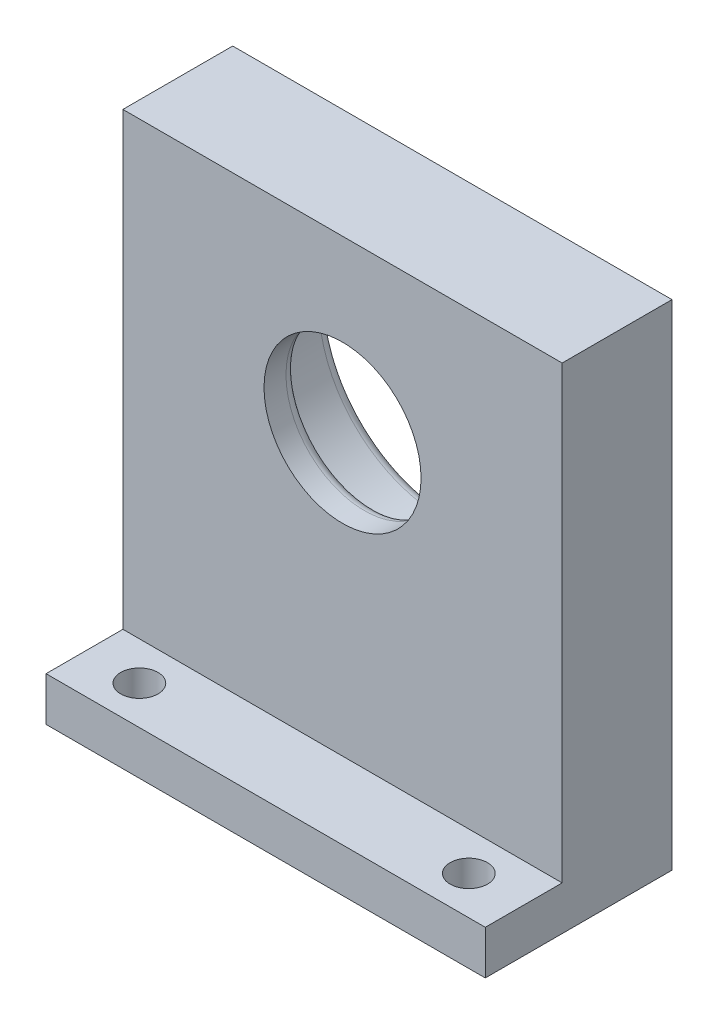
ISO-10303-21;
HEADER;
FILE_DESCRIPTION(('STEP AP214'),'2;1');
FILE_NAME('part.step','',(''),(''),'','','');
FILE_SCHEMA(('AUTOMOTIVE_DESIGN { 1 0 10303 214 1 1 1 1 }'));
ENDSEC;
DATA;
#1=APPLICATION_CONTEXT('core data for automotive mechanical design processes');
#2=APPLICATION_PROTOCOL_DEFINITION('international standard','automotive_design',2000,#1);
#3=PRODUCT_CONTEXT('',#1,'mechanical');
#4=PRODUCT('Part','Part','',(#3));
#5=PRODUCT_RELATED_PRODUCT_CATEGORY('part','',(#4));
#6=PRODUCT_DEFINITION_FORMATION('','',#4);
#7=PRODUCT_DEFINITION_CONTEXT('part definition',#1,'design');
#8=PRODUCT_DEFINITION('design','',#6,#7);
#9=PRODUCT_DEFINITION_SHAPE('','',#8);
#10=(LENGTH_UNIT() NAMED_UNIT(*) SI_UNIT(.MILLI.,.METRE.));
#11=(NAMED_UNIT(*) PLANE_ANGLE_UNIT() SI_UNIT($,.RADIAN.));
#12=(NAMED_UNIT(*) SI_UNIT($,.STERADIAN.) SOLID_ANGLE_UNIT());
#13=UNCERTAINTY_MEASURE_WITH_UNIT(LENGTH_MEASURE(1.E-05),#10,'distance_accuracy_value','');
#14=(GEOMETRIC_REPRESENTATION_CONTEXT(3) GLOBAL_UNCERTAINTY_ASSIGNED_CONTEXT((#13)) GLOBAL_UNIT_ASSIGNED_CONTEXT((#10,
#11,#12)) REPRESENTATION_CONTEXT('',''));
#15=CARTESIAN_POINT('',(0.,0.,0.));
#16=DIRECTION('',(0.,0.,1.));
#17=DIRECTION('',(1.,0.,0.));
#18=AXIS2_PLACEMENT_3D('',#15,#16,#17);
#19=CARTESIAN_POINT('',(0.,0.,0.));
#20=DIRECTION('',(0.,0.,-1.));
#21=DIRECTION('',(-1.,0.,0.));
#22=AXIS2_PLACEMENT_3D('',#19,#20,#21);
#23=PLANE('',#22);
#24=CARTESIAN_POINT('',(0.,6.99999999999999,0.));
#25=DIRECTION('',(0.,0.,-1.));
#26=DIRECTION('',(-1.,0.,0.));
#27=AXIS2_PLACEMENT_3D('',#24,#25,#26);
#28=CIRCLE('',#27,12.15);
#29=CARTESIAN_POINT('',(-12.15,6.99999999999999,0.));
#30=VERTEX_POINT('',#29);
#31=EDGE_CURVE('E154',#30,#30,#28,.F.);
#32=ORIENTED_EDGE('',*,*,#31,.T.);
#33=EDGE_LOOP('',(#32));
#34=FACE_BOUND('',#33,.T.);
#35=DIRECTION('',(0.,1.,0.));
#36=VECTOR('',#35,1.);
#37=CARTESIAN_POINT('',(20.,-22.5,0.));
#38=LINE('',#37,#36);
#39=CARTESIAN_POINT('',(20.,-22.5,0.));
#40=VERTEX_POINT('',#39);
#41=CARTESIAN_POINT('',(20.,22.5,0.));
#42=VERTEX_POINT('',#41);
#43=EDGE_CURVE('E142',#40,#42,#38,.T.);
#44=ORIENTED_EDGE('',*,*,#43,.F.);
#45=DIRECTION('',(1.,0.,0.));
#46=VECTOR('',#45,1.);
#47=CARTESIAN_POINT('',(-20.,-22.5,0.));
#48=LINE('',#47,#46);
#49=CARTESIAN_POINT('',(-20.,-22.5,0.));
#50=VERTEX_POINT('',#49);
#51=EDGE_CURVE('E62',#50,#40,#48,.T.);
#52=ORIENTED_EDGE('',*,*,#51,.F.);
#53=DIRECTION('',(0.,-1.,0.));
#54=VECTOR('',#53,1.);
#55=CARTESIAN_POINT('',(-20.,-22.5,0.));
#56=LINE('',#55,#54);
#57=CARTESIAN_POINT('',(-20.,22.5,0.));
#58=VERTEX_POINT('',#57);
#59=EDGE_CURVE('E100',#58,#50,#56,.T.);
#60=ORIENTED_EDGE('',*,*,#59,.F.);
#61=DIRECTION('',(-1.,0.,0.));
#62=VECTOR('',#61,1.);
#63=CARTESIAN_POINT('',(-20.,22.5,0.));
#64=LINE('',#63,#62);
#65=EDGE_CURVE('E145',#42,#58,#64,.T.);
#66=ORIENTED_EDGE('',*,*,#65,.F.);
#67=EDGE_LOOP('',(#44,#52,#60,#66));
#68=FACE_BOUND('',#67,.T.);
#69=ADVANCED_FACE('F39',(#34,#68),#23,.T.);
#70=CARTESIAN_POINT('',(20.,-22.5,7.));
#71=DIRECTION('',(-1.,0.,0.));
#72=DIRECTION('',(0.,-1.,0.));
#73=AXIS2_PLACEMENT_3D('',#70,#71,#72);
#74=PLANE('',#73);
#75=ORIENTED_EDGE('',*,*,#43,.T.);
#76=DIRECTION('',(0.,0.,-1.));
#77=VECTOR('',#76,1.);
#78=CARTESIAN_POINT('',(20.,22.5,7.));
#79=LINE('',#78,#77);
#80=CARTESIAN_POINT('',(20.,22.5,9.99999999999999));
#81=VERTEX_POINT('',#80);
#82=EDGE_CURVE('E151',#81,#42,#79,.T.);
#83=ORIENTED_EDGE('',*,*,#82,.F.);
#84=DIRECTION('',(0.,1.,0.));
#85=VECTOR('',#84,1.);
#86=CARTESIAN_POINT('',(20.,-22.5,9.99999999999999));
#87=LINE('',#86,#85);
#88=CARTESIAN_POINT('',(20.,-18.5,9.99999999999999));
#89=VERTEX_POINT('',#88);
#90=EDGE_CURVE('E132',#89,#81,#87,.T.);
#91=ORIENTED_EDGE('',*,*,#90,.F.);
#92=DIRECTION('',(0.,0.,-1.));
#93=VECTOR('',#92,1.);
#94=CARTESIAN_POINT('',(20.,-18.5,17.));
#95=LINE('',#94,#93);
#96=CARTESIAN_POINT('',(20.,-18.5,17.));
#97=VERTEX_POINT('',#96);
#98=EDGE_CURVE('E126',#97,#89,#95,.T.);
#99=ORIENTED_EDGE('',*,*,#98,.F.);
#100=DIRECTION('',(0.,1.,0.));
#101=VECTOR('',#100,1.);
#102=CARTESIAN_POINT('',(20.,-18.5,17.));
#103=LINE('',#102,#101);
#104=CARTESIAN_POINT('',(20.,-22.5,17.));
#105=VERTEX_POINT('',#104);
#106=EDGE_CURVE('E109',#105,#97,#103,.T.);
#107=ORIENTED_EDGE('',*,*,#106,.F.);
#108=DIRECTION('',(0.,0.,-1.));
#109=VECTOR('',#108,1.);
#110=CARTESIAN_POINT('',(20.,-22.5,7.));
#111=LINE('',#110,#109);
#112=EDGE_CURVE('E102',#105,#40,#111,.T.);
#113=ORIENTED_EDGE('',*,*,#112,.T.);
#114=EDGE_LOOP('',(#75,#83,#91,#99,#107,#113));
#115=FACE_BOUND('',#114,.T.);
#116=ADVANCED_FACE('F180',(#115),#74,.F.);
#117=CARTESIAN_POINT('',(-20.,22.5,7.));
#118=DIRECTION('',(0.,-1.,0.));
#119=DIRECTION('',(0.,0.,-1.));
#120=AXIS2_PLACEMENT_3D('',#117,#118,#119);
#121=PLANE('',#120);
#122=ORIENTED_EDGE('',*,*,#65,.T.);
#123=DIRECTION('',(0.,0.,-1.));
#124=VECTOR('',#123,1.);
#125=CARTESIAN_POINT('',(-20.,22.5,7.));
#126=LINE('',#125,#124);
#127=CARTESIAN_POINT('',(-20.,22.5,9.99999999999999));
#128=VERTEX_POINT('',#127);
#129=EDGE_CURVE('E101',#128,#58,#126,.T.);
#130=ORIENTED_EDGE('',*,*,#129,.F.);
#131=DIRECTION('',(-1.,0.,0.));
#132=VECTOR('',#131,1.);
#133=CARTESIAN_POINT('',(20.,22.5,9.99999999999999));
#134=LINE('',#133,#132);
#135=EDGE_CURVE('E134',#81,#128,#134,.T.);
#136=ORIENTED_EDGE('',*,*,#135,.F.);
#137=ORIENTED_EDGE('',*,*,#82,.T.);
#138=EDGE_LOOP('',(#122,#130,#136,#137));
#139=FACE_BOUND('',#138,.T.);
#140=ADVANCED_FACE('F187',(#139),#121,.F.);
#141=CARTESIAN_POINT('',(-20.,-22.5,7.));
#142=DIRECTION('',(1.,0.,0.));
#143=DIRECTION('',(0.,1.,0.));
#144=AXIS2_PLACEMENT_3D('',#141,#142,#143);
#145=PLANE('',#144);
#146=ORIENTED_EDGE('',*,*,#59,.T.);
#147=DIRECTION('',(0.,0.,-1.));
#148=VECTOR('',#147,1.);
#149=CARTESIAN_POINT('',(-20.,-22.5,7.));
#150=LINE('',#149,#148);
#151=CARTESIAN_POINT('',(-20.,-22.5,17.));
#152=VERTEX_POINT('',#151);
#153=EDGE_CURVE('E92',#152,#50,#150,.T.);
#154=ORIENTED_EDGE('',*,*,#153,.F.);
#155=DIRECTION('',(0.,-1.,0.));
#156=VECTOR('',#155,1.);
#157=CARTESIAN_POINT('',(-20.,-22.5,17.));
#158=LINE('',#157,#156);
#159=CARTESIAN_POINT('',(-20.,-18.5,17.));
#160=VERTEX_POINT('',#159);
#161=EDGE_CURVE('E97',#160,#152,#158,.T.);
#162=ORIENTED_EDGE('',*,*,#161,.F.);
#163=DIRECTION('',(0.,0.,-1.));
#164=VECTOR('',#163,1.);
#165=CARTESIAN_POINT('',(-20.,-18.5,17.));
#166=LINE('',#165,#164);
#167=CARTESIAN_POINT('',(-20.,-18.5,9.99999999999999));
#168=VERTEX_POINT('',#167);
#169=EDGE_CURVE('E123',#160,#168,#166,.T.);
#170=ORIENTED_EDGE('',*,*,#169,.T.);
#171=DIRECTION('',(0.,-1.,0.));
#172=VECTOR('',#171,1.);
#173=CARTESIAN_POINT('',(-20.,22.5,9.99999999999999));
#174=LINE('',#173,#172);
#175=EDGE_CURVE('E137',#128,#168,#174,.T.);
#176=ORIENTED_EDGE('',*,*,#175,.F.);
#177=ORIENTED_EDGE('',*,*,#129,.T.);
#178=EDGE_LOOP('',(#146,#154,#162,#170,#176,#177));
#179=FACE_BOUND('',#178,.T.);
#180=ADVANCED_FACE('F94',(#179),#145,.F.);
#181=CARTESIAN_POINT('',(-20.,-22.5,7.));
#182=DIRECTION('',(0.,1.,0.));
#183=DIRECTION('',(-1.,0.,0.));
#184=AXIS2_PLACEMENT_3D('',#181,#182,#183);
#185=PLANE('',#184);
#186=CARTESIAN_POINT('',(-15.,-22.5,13.5));
#187=DIRECTION('',(0.,1.,0.));
#188=DIRECTION('',(0.,0.,1.));
#189=AXIS2_PLACEMENT_3D('',#186,#187,#188);
#190=CIRCLE('',#189,1.7);
#191=CARTESIAN_POINT('',(-15.,-22.5,15.2));
#192=VERTEX_POINT('',#191);
#193=EDGE_CURVE('E116',#192,#192,#190,.T.);
#194=ORIENTED_EDGE('',*,*,#193,.T.);
#195=EDGE_LOOP('',(#194));
#196=FACE_BOUND('',#195,.T.);
#197=CARTESIAN_POINT('',(15.,-22.5,13.5));
#198=DIRECTION('',(0.,1.,0.));
#199=DIRECTION('',(0.,0.,1.));
#200=AXIS2_PLACEMENT_3D('',#197,#198,#199);
#201=CIRCLE('',#200,1.7);
#202=CARTESIAN_POINT('',(15.,-22.5,15.2));
#203=VERTEX_POINT('',#202);
#204=EDGE_CURVE('E119',#203,#203,#201,.T.);
#205=ORIENTED_EDGE('',*,*,#204,.T.);
#206=EDGE_LOOP('',(#205));
#207=FACE_BOUND('',#206,.T.);
#208=ORIENTED_EDGE('',*,*,#51,.T.);
#209=ORIENTED_EDGE('',*,*,#112,.F.);
#210=DIRECTION('',(1.,0.,0.));
#211=VECTOR('',#210,1.);
#212=CARTESIAN_POINT('',(-20.,-22.5,17.));
#213=LINE('',#212,#211);
#214=EDGE_CURVE('E105',#152,#105,#213,.T.);
#215=ORIENTED_EDGE('',*,*,#214,.F.);
#216=ORIENTED_EDGE('',*,*,#153,.T.);
#217=EDGE_LOOP('',(#208,#209,#215,#216));
#218=FACE_BOUND('',#217,.T.);
#219=ADVANCED_FACE('F106',(#196,#207,#218),#185,.F.);
#220=CARTESIAN_POINT('',(0.,6.99999999999999,7.));
#221=DIRECTION('',(0.,0.,-1.));
#222=DIRECTION('',(-1.,0.,0.));
#223=AXIS2_PLACEMENT_3D('',#220,#221,#222);
#224=CYLINDRICAL_SURFACE('',#223,11.15);
#225=CARTESIAN_POINT('',(0.,6.99999999999999,1.));
#226=DIRECTION('',(0.,0.,-1.));
#227=DIRECTION('',(-1.,0.,0.));
#228=AXIS2_PLACEMENT_3D('',#225,#226,#227);
#229=CIRCLE('',#228,11.15);
#230=CARTESIAN_POINT('',(-11.15,6.99999999999999,1.));
#231=VERTEX_POINT('',#230);
#232=EDGE_CURVE('E157',#231,#231,#229,.T.);
#233=ORIENTED_EDGE('',*,*,#232,.T.);
#234=EDGE_LOOP('',(#233));
#235=FACE_BOUND('',#234,.T.);
#236=CARTESIAN_POINT('',(0.,6.99999999999999,7.));
#237=DIRECTION('',(0.,0.,1.));
#238=DIRECTION('',(1.,0.,0.));
#239=AXIS2_PLACEMENT_3D('',#236,#237,#238);
#240=CIRCLE('',#239,11.15);
#241=CARTESIAN_POINT('',(11.15,6.99999999999999,7.));
#242=VERTEX_POINT('',#241);
#243=EDGE_CURVE('E139',#242,#242,#240,.T.);
#244=ORIENTED_EDGE('',*,*,#243,.T.);
#245=EDGE_LOOP('',(#244));
#246=FACE_BOUND('',#245,.T.);
#247=ADVANCED_FACE('F193',(#235,#246),#224,.F.);
#248=CARTESIAN_POINT('',(0.,0.,7.));
#249=DIRECTION('',(0.,0.,1.));
#250=DIRECTION('',(1.,0.,0.));
#251=AXIS2_PLACEMENT_3D('',#248,#249,#250);
#252=PLANE('',#251);
#253=CARTESIAN_POINT('',(0.,6.99999999999999,7.));
#254=DIRECTION('',(0.,0.,1.));
#255=DIRECTION('',(1.,0.,0.));
#256=AXIS2_PLACEMENT_3D('',#253,#254,#255);
#257=CIRCLE('',#256,8.14999999999999);
#258=CARTESIAN_POINT('',(8.14999999999999,6.99999999999999,7.));
#259=VERTEX_POINT('',#258);
#260=EDGE_CURVE('E47',#259,#259,#257,.T.);
#261=ORIENTED_EDGE('',*,*,#260,.T.);
#262=EDGE_LOOP('',(#261));
#263=FACE_BOUND('',#262,.T.);
#264=ORIENTED_EDGE('',*,*,#243,.F.);
#265=EDGE_LOOP('',(#264));
#266=FACE_BOUND('',#265,.T.);
#267=ADVANCED_FACE('F162',(#263,#266),#252,.F.);
#268=CARTESIAN_POINT('',(0.,0.,9.99999999999999));
#269=DIRECTION('',(0.,0.,1.));
#270=DIRECTION('',(1.,0.,0.));
#271=AXIS2_PLACEMENT_3D('',#268,#269,#270);
#272=PLANE('',#271);
#273=DIRECTION('',(-1.,0.,0.));
#274=VECTOR('',#273,1.);
#275=CARTESIAN_POINT('',(-20.,-18.5,9.99999999999999));
#276=LINE('',#275,#274);
#277=EDGE_CURVE('E54',#89,#168,#276,.T.);
#278=ORIENTED_EDGE('',*,*,#277,.F.);
#279=ORIENTED_EDGE('',*,*,#90,.T.);
#280=ORIENTED_EDGE('',*,*,#135,.T.);
#281=ORIENTED_EDGE('',*,*,#175,.T.);
#282=EDGE_LOOP('',(#278,#279,#280,#281));
#283=FACE_BOUND('',#282,.T.);
#284=CARTESIAN_POINT('',(0.,6.99999999999999,9.99999999999999));
#285=DIRECTION('',(0.,0.,1.));
#286=DIRECTION('',(1.,0.,0.));
#287=AXIS2_PLACEMENT_3D('',#284,#285,#286);
#288=CIRCLE('',#287,7.14999999999999);
#289=CARTESIAN_POINT('',(7.14999999999999,6.99999999999999,9.99999999999999));
#290=VERTEX_POINT('',#289);
#291=EDGE_CURVE('E129',#290,#290,#288,.T.);
#292=ORIENTED_EDGE('',*,*,#291,.F.);
#293=EDGE_LOOP('',(#292));
#294=FACE_BOUND('',#293,.T.);
#295=ADVANCED_FACE('F209',(#283,#294),#272,.T.);
#296=CARTESIAN_POINT('',(0.,6.99999999999999,9.99999999999999));
#297=DIRECTION('',(0.,0.,-1.));
#298=DIRECTION('',(-1.,0.,0.));
#299=AXIS2_PLACEMENT_3D('',#296,#297,#298);
#300=CYLINDRICAL_SURFACE('',#299,7.14999999999999);
#301=CARTESIAN_POINT('',(0.,6.99999999999999,8.));
#302=DIRECTION('',(0.,0.,1.));
#303=DIRECTION('',(1.,0.,0.));
#304=AXIS2_PLACEMENT_3D('',#301,#302,#303);
#305=CIRCLE('',#304,7.14999999999999);
#306=CARTESIAN_POINT('',(7.14999999999999,6.99999999999999,8.));
#307=VERTEX_POINT('',#306);
#308=EDGE_CURVE('E11',#307,#307,#305,.F.);
#309=ORIENTED_EDGE('',*,*,#308,.T.);
#310=EDGE_LOOP('',(#309));
#311=FACE_BOUND('',#310,.T.);
#312=ORIENTED_EDGE('',*,*,#291,.T.);
#313=EDGE_LOOP('',(#312));
#314=FACE_BOUND('',#313,.T.);
#315=ADVANCED_FACE('F176',(#311,#314),#300,.F.);
#316=CARTESIAN_POINT('',(0.,6.99999999999999,1.));
#317=DIRECTION('',(0.,0.,-1.));
#318=DIRECTION('',(-1.,0.,0.));
#319=AXIS2_PLACEMENT_3D('',#316,#317,#318);
#320=TOROIDAL_SURFACE('',#319,12.15,1.);
#321=ORIENTED_EDGE('',*,*,#232,.F.);
#322=EDGE_LOOP('',(#321));
#323=FACE_BOUND('',#322,.T.);
#324=ORIENTED_EDGE('',*,*,#31,.F.);
#325=EDGE_LOOP('',(#324));
#326=FACE_BOUND('',#325,.T.);
#327=ADVANCED_FACE('F167',(#323,#326),#320,.T.);
#328=CARTESIAN_POINT('',(0.,6.99999999999999,8.));
#329=DIRECTION('',(0.,0.,1.));
#330=DIRECTION('',(1.,0.,0.));
#331=AXIS2_PLACEMENT_3D('',#328,#329,#330);
#332=TOROIDAL_SURFACE('',#331,8.14999999999999,1.);
#333=ORIENTED_EDGE('',*,*,#308,.F.);
#334=EDGE_LOOP('',(#333));
#335=FACE_BOUND('',#334,.T.);
#336=ORIENTED_EDGE('',*,*,#260,.F.);
#337=EDGE_LOOP('',(#336));
#338=FACE_BOUND('',#337,.T.);
#339=ADVANCED_FACE('F41',(#335,#338),#332,.T.);
#340=CARTESIAN_POINT('',(-20.,-18.5,17.));
#341=DIRECTION('',(0.,-1.,0.));
#342=DIRECTION('',(0.,0.,-1.));
#343=AXIS2_PLACEMENT_3D('',#340,#341,#342);
#344=PLANE('',#343);
#345=CARTESIAN_POINT('',(-15.,-18.5,13.5));
#346=DIRECTION('',(0.,1.,0.));
#347=DIRECTION('',(0.,0.,1.));
#348=AXIS2_PLACEMENT_3D('',#345,#346,#347);
#349=CIRCLE('',#348,1.7);
#350=CARTESIAN_POINT('',(-15.,-18.5,15.2));
#351=VERTEX_POINT('',#350);
#352=EDGE_CURVE('E335',#351,#351,#349,.T.);
#353=ORIENTED_EDGE('',*,*,#352,.F.);
#354=EDGE_LOOP('',(#353));
#355=FACE_BOUND('',#354,.T.);
#356=CARTESIAN_POINT('',(15.,-18.5,13.5));
#357=DIRECTION('',(0.,1.,0.));
#358=DIRECTION('',(0.,0.,1.));
#359=AXIS2_PLACEMENT_3D('',#356,#357,#358);
#360=CIRCLE('',#359,1.7);
#361=CARTESIAN_POINT('',(15.,-18.5,15.2));
#362=VERTEX_POINT('',#361);
#363=EDGE_CURVE('E336',#362,#362,#360,.T.);
#364=ORIENTED_EDGE('',*,*,#363,.F.);
#365=EDGE_LOOP('',(#364));
#366=FACE_BOUND('',#365,.T.);
#367=ORIENTED_EDGE('',*,*,#277,.T.);
#368=ORIENTED_EDGE('',*,*,#169,.F.);
#369=DIRECTION('',(-1.,0.,0.));
#370=VECTOR('',#369,1.);
#371=CARTESIAN_POINT('',(-20.,-18.5,17.));
#372=LINE('',#371,#370);
#373=EDGE_CURVE('E113',#97,#160,#372,.T.);
#374=ORIENTED_EDGE('',*,*,#373,.F.);
#375=ORIENTED_EDGE('',*,*,#98,.T.);
#376=EDGE_LOOP('',(#367,#368,#374,#375));
#377=FACE_BOUND('',#376,.T.);
#378=ADVANCED_FACE('F166',(#355,#366,#377),#344,.F.);
#379=CARTESIAN_POINT('',(0.,0.,17.));
#380=DIRECTION('',(0.,0.,-1.));
#381=DIRECTION('',(-1.,0.,0.));
#382=AXIS2_PLACEMENT_3D('',#379,#380,#381);
#383=PLANE('',#382);
#384=ORIENTED_EDGE('',*,*,#161,.T.);
#385=ORIENTED_EDGE('',*,*,#214,.T.);
#386=ORIENTED_EDGE('',*,*,#106,.T.);
#387=ORIENTED_EDGE('',*,*,#373,.T.);
#388=EDGE_LOOP('',(#384,#385,#386,#387));
#389=FACE_BOUND('',#388,.T.);
#390=ADVANCED_FACE('F111',(#389),#383,.F.);
#391=CARTESIAN_POINT('',(15.,-22.5,13.5));
#392=DIRECTION('',(0.,1.,0.));
#393=DIRECTION('',(0.,0.,1.));
#394=AXIS2_PLACEMENT_3D('',#391,#392,#393);
#395=CYLINDRICAL_SURFACE('',#394,1.7);
#396=ORIENTED_EDGE('',*,*,#204,.F.);
#397=EDGE_LOOP('',(#396));
#398=FACE_BOUND('',#397,.T.);
#399=ORIENTED_EDGE('',*,*,#363,.T.);
#400=EDGE_LOOP('',(#399));
#401=FACE_BOUND('',#400,.T.);
#402=ADVANCED_FACE('F306',(#398,#401),#395,.F.);
#403=CARTESIAN_POINT('',(-15.,-22.5,13.5));
#404=DIRECTION('',(0.,1.,0.));
#405=DIRECTION('',(0.,0.,1.));
#406=AXIS2_PLACEMENT_3D('',#403,#404,#405);
#407=CYLINDRICAL_SURFACE('',#406,1.7);
#408=ORIENTED_EDGE('',*,*,#193,.F.);
#409=EDGE_LOOP('',(#408));
#410=FACE_BOUND('',#409,.T.);
#411=ORIENTED_EDGE('',*,*,#352,.T.);
#412=EDGE_LOOP('',(#411));
#413=FACE_BOUND('',#412,.T.);
#414=ADVANCED_FACE('F313',(#410,#413),#407,.F.);
#415=CLOSED_SHELL('',(#69,#116,#140,#180,#219,#247,#267,#295,#315,#327,#339,#378,#390,#402,#414));
#416=MANIFOLD_SOLID_BREP('B2',#415);
#417=ADVANCED_BREP_SHAPE_REPRESENTATION('',(#18,#416),#14);
#418=SHAPE_DEFINITION_REPRESENTATION(#9,#417);
ENDSEC;
END-ISO-10303-21;
